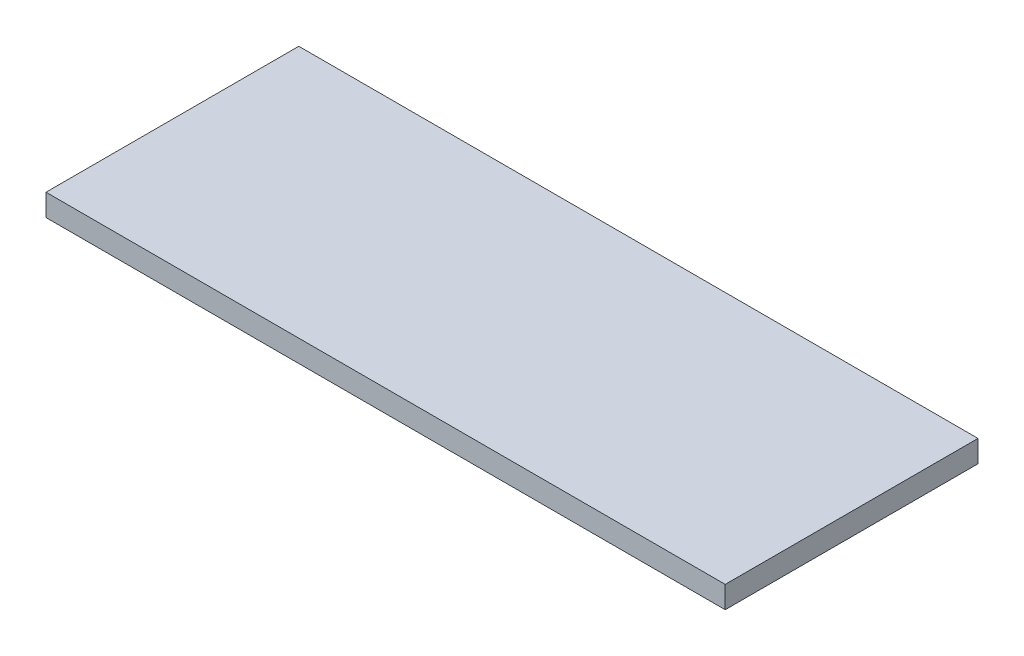
ISO-10303-21;
HEADER;
FILE_DESCRIPTION(('STEP AP214'),'2;1');
FILE_NAME('part.step','',(''),(''),'','','');
FILE_SCHEMA(('AUTOMOTIVE_DESIGN { 1 0 10303 214 1 1 1 1 }'));
ENDSEC;
DATA;
#1=APPLICATION_CONTEXT('core data for automotive mechanical design processes');
#2=APPLICATION_PROTOCOL_DEFINITION('international standard','automotive_design',2000,#1);
#3=PRODUCT_CONTEXT('',#1,'mechanical');
#4=PRODUCT('Part','Part','',(#3));
#5=PRODUCT_RELATED_PRODUCT_CATEGORY('part','',(#4));
#6=PRODUCT_DEFINITION_FORMATION('','',#4);
#7=PRODUCT_DEFINITION_CONTEXT('part definition',#1,'design');
#8=PRODUCT_DEFINITION('design','',#6,#7);
#9=PRODUCT_DEFINITION_SHAPE('','',#8);
#10=(LENGTH_UNIT() NAMED_UNIT(*) SI_UNIT(.MILLI.,.METRE.));
#11=(NAMED_UNIT(*) PLANE_ANGLE_UNIT() SI_UNIT($,.RADIAN.));
#12=(NAMED_UNIT(*) SI_UNIT($,.STERADIAN.) SOLID_ANGLE_UNIT());
#13=UNCERTAINTY_MEASURE_WITH_UNIT(LENGTH_MEASURE(1.E-05),#10,'distance_accuracy_value','');
#14=(GEOMETRIC_REPRESENTATION_CONTEXT(3) GLOBAL_UNCERTAINTY_ASSIGNED_CONTEXT((#13)) GLOBAL_UNIT_ASSIGNED_CONTEXT((#10,
#11,#12)) REPRESENTATION_CONTEXT('',''));
#15=CARTESIAN_POINT('',(0.,0.,0.));
#16=DIRECTION('',(0.,0.,1.));
#17=DIRECTION('',(1.,0.,0.));
#18=AXIS2_PLACEMENT_3D('',#15,#16,#17);
#19=CARTESIAN_POINT('',(0.,10.,0.));
#20=DIRECTION('',(1.,0.,0.));
#21=DIRECTION('',(0.,0.,-1.));
#22=AXIS2_PLACEMENT_3D('',#19,#20,#21);
#23=PLANE('',#22);
#24=DIRECTION('',(0.,0.,1.));
#25=VECTOR('',#24,1.);
#26=CARTESIAN_POINT('',(0.,0.,0.));
#27=LINE('',#26,#25);
#28=CARTESIAN_POINT('',(0.,0.,-115.));
#29=VERTEX_POINT('',#28);
#30=CARTESIAN_POINT('',(0.,0.,0.));
#31=VERTEX_POINT('',#30);
#32=EDGE_CURVE('E107',#29,#31,#27,.T.);
#33=ORIENTED_EDGE('',*,*,#32,.T.);
#34=DIRECTION('',(0.,-1.,0.));
#35=VECTOR('',#34,1.);
#36=CARTESIAN_POINT('',(0.,10.,0.));
#37=LINE('',#36,#35);
#38=CARTESIAN_POINT('',(0.,10.,0.));
#39=VERTEX_POINT('',#38);
#40=EDGE_CURVE('E11',#39,#31,#37,.T.);
#41=ORIENTED_EDGE('',*,*,#40,.F.);
#42=DIRECTION('',(0.,0.,1.));
#43=VECTOR('',#42,1.);
#44=CARTESIAN_POINT('',(0.,10.,0.));
#45=LINE('',#44,#43);
#46=CARTESIAN_POINT('',(0.,10.,-115.));
#47=VERTEX_POINT('',#46);
#48=EDGE_CURVE('E91',#47,#39,#45,.T.);
#49=ORIENTED_EDGE('',*,*,#48,.F.);
#50=DIRECTION('',(0.,-1.,0.));
#51=VECTOR('',#50,1.);
#52=CARTESIAN_POINT('',(0.,10.,-115.));
#53=LINE('',#52,#51);
#54=EDGE_CURVE('E103',#47,#29,#53,.T.);
#55=ORIENTED_EDGE('',*,*,#54,.T.);
#56=EDGE_LOOP('',(#33,#41,#49,#55));
#57=FACE_BOUND('',#56,.T.);
#58=ADVANCED_FACE('F39',(#57),#23,.F.);
#59=CARTESIAN_POINT('',(0.,10.,0.));
#60=DIRECTION('',(0.,0.,-1.));
#61=DIRECTION('',(-1.,0.,0.));
#62=AXIS2_PLACEMENT_3D('',#59,#60,#61);
#63=PLANE('',#62);
#64=DIRECTION('',(1.,0.,0.));
#65=VECTOR('',#64,1.);
#66=CARTESIAN_POINT('',(0.,0.,0.));
#67=LINE('',#66,#65);
#68=CARTESIAN_POINT('',(309.,0.,0.));
#69=VERTEX_POINT('',#68);
#70=EDGE_CURVE('E96',#31,#69,#67,.T.);
#71=ORIENTED_EDGE('',*,*,#70,.T.);
#72=DIRECTION('',(0.,-1.,0.));
#73=VECTOR('',#72,1.);
#74=CARTESIAN_POINT('',(309.,10.,0.));
#75=LINE('',#74,#73);
#76=CARTESIAN_POINT('',(309.,10.,0.));
#77=VERTEX_POINT('',#76);
#78=EDGE_CURVE('E48',#77,#69,#75,.T.);
#79=ORIENTED_EDGE('',*,*,#78,.F.);
#80=DIRECTION('',(1.,0.,0.));
#81=VECTOR('',#80,1.);
#82=CARTESIAN_POINT('',(0.,10.,0.));
#83=LINE('',#82,#81);
#84=EDGE_CURVE('E86',#39,#77,#83,.T.);
#85=ORIENTED_EDGE('',*,*,#84,.F.);
#86=ORIENTED_EDGE('',*,*,#40,.T.);
#87=EDGE_LOOP('',(#71,#79,#85,#86));
#88=FACE_BOUND('',#87,.T.);
#89=ADVANCED_FACE('F95',(#88),#63,.F.);
#90=CARTESIAN_POINT('',(309.,10.,0.));
#91=DIRECTION('',(-1.,0.,0.));
#92=DIRECTION('',(0.,0.,1.));
#93=AXIS2_PLACEMENT_3D('',#90,#91,#92);
#94=PLANE('',#93);
#95=DIRECTION('',(0.,0.,-1.));
#96=VECTOR('',#95,1.);
#97=CARTESIAN_POINT('',(309.,0.,0.));
#98=LINE('',#97,#96);
#99=CARTESIAN_POINT('',(309.,0.,-115.));
#100=VERTEX_POINT('',#99);
#101=EDGE_CURVE('E73',#69,#100,#98,.T.);
#102=ORIENTED_EDGE('',*,*,#101,.T.);
#103=DIRECTION('',(0.,-1.,0.));
#104=VECTOR('',#103,1.);
#105=CARTESIAN_POINT('',(309.,10.,-115.));
#106=LINE('',#105,#104);
#107=CARTESIAN_POINT('',(309.,10.,-115.));
#108=VERTEX_POINT('',#107);
#109=EDGE_CURVE('E98',#108,#100,#106,.T.);
#110=ORIENTED_EDGE('',*,*,#109,.F.);
#111=DIRECTION('',(0.,0.,-1.));
#112=VECTOR('',#111,1.);
#113=CARTESIAN_POINT('',(309.,10.,0.));
#114=LINE('',#113,#112);
#115=EDGE_CURVE('E89',#77,#108,#114,.T.);
#116=ORIENTED_EDGE('',*,*,#115,.F.);
#117=ORIENTED_EDGE('',*,*,#78,.T.);
#118=EDGE_LOOP('',(#102,#110,#116,#117));
#119=FACE_BOUND('',#118,.T.);
#120=ADVANCED_FACE('F99',(#119),#94,.F.);
#121=CARTESIAN_POINT('',(0.,10.,-115.));
#122=DIRECTION('',(0.,0.,1.));
#123=DIRECTION('',(1.,0.,0.));
#124=AXIS2_PLACEMENT_3D('',#121,#122,#123);
#125=PLANE('',#124);
#126=DIRECTION('',(-1.,0.,0.));
#127=VECTOR('',#126,1.);
#128=CARTESIAN_POINT('',(0.,0.,-115.));
#129=LINE('',#128,#127);
#130=EDGE_CURVE('E79',#100,#29,#129,.T.);
#131=ORIENTED_EDGE('',*,*,#130,.T.);
#132=ORIENTED_EDGE('',*,*,#54,.F.);
#133=DIRECTION('',(-1.,0.,0.));
#134=VECTOR('',#133,1.);
#135=CARTESIAN_POINT('',(0.,10.,-115.));
#136=LINE('',#135,#134);
#137=EDGE_CURVE('E56',#108,#47,#136,.T.);
#138=ORIENTED_EDGE('',*,*,#137,.F.);
#139=ORIENTED_EDGE('',*,*,#109,.T.);
#140=EDGE_LOOP('',(#131,#132,#138,#139));
#141=FACE_BOUND('',#140,.T.);
#142=ADVANCED_FACE('F120',(#141),#125,.F.);
#143=CARTESIAN_POINT('',(0.,10.,0.));
#144=DIRECTION('',(0.,-1.,0.));
#145=DIRECTION('',(0.,0.,-1.));
#146=AXIS2_PLACEMENT_3D('',#143,#144,#145);
#147=PLANE('',#146);
#148=ORIENTED_EDGE('',*,*,#48,.T.);
#149=ORIENTED_EDGE('',*,*,#84,.T.);
#150=ORIENTED_EDGE('',*,*,#115,.T.);
#151=ORIENTED_EDGE('',*,*,#137,.T.);
#152=EDGE_LOOP('',(#148,#149,#150,#151));
#153=FACE_BOUND('',#152,.T.);
#154=ADVANCED_FACE('F87',(#153),#147,.F.);
#155=CARTESIAN_POINT('',(0.,0.,0.));
#156=DIRECTION('',(0.,-1.,0.));
#157=DIRECTION('',(0.,0.,-1.));
#158=AXIS2_PLACEMENT_3D('',#155,#156,#157);
#159=PLANE('',#158);
#160=ORIENTED_EDGE('',*,*,#32,.F.);
#161=ORIENTED_EDGE('',*,*,#130,.F.);
#162=ORIENTED_EDGE('',*,*,#101,.F.);
#163=ORIENTED_EDGE('',*,*,#70,.F.);
#164=EDGE_LOOP('',(#160,#161,#162,#163));
#165=FACE_BOUND('',#164,.T.);
#166=ADVANCED_FACE('F123',(#165),#159,.T.);
#167=CLOSED_SHELL('',(#58,#89,#120,#142,#154,#166));
#168=MANIFOLD_SOLID_BREP('B2',#167);
#169=ADVANCED_BREP_SHAPE_REPRESENTATION('',(#18,#168),#14);
#170=SHAPE_DEFINITION_REPRESENTATION(#9,#169);
ENDSEC;
END-ISO-10303-21;
